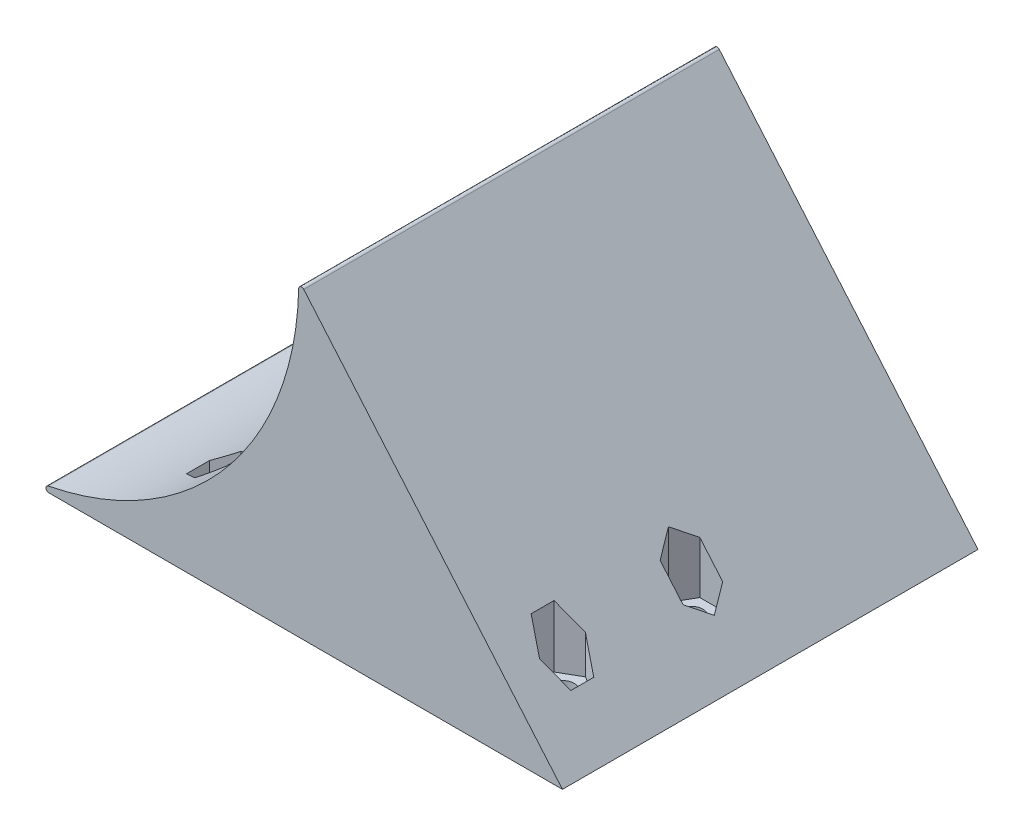
ISO-10303-21;
HEADER;
FILE_DESCRIPTION(('STEP AP214'),'2;1');
FILE_NAME('part.step','',(''),(''),'','','');
FILE_SCHEMA(('AUTOMOTIVE_DESIGN { 1 0 10303 214 1 1 1 1 }'));
ENDSEC;
DATA;
#1=APPLICATION_CONTEXT('core data for automotive mechanical design processes');
#2=APPLICATION_PROTOCOL_DEFINITION('international standard','automotive_design',2000,#1);
#3=PRODUCT_CONTEXT('',#1,'mechanical');
#4=PRODUCT('Part','Part','',(#3));
#5=PRODUCT_RELATED_PRODUCT_CATEGORY('part','',(#4));
#6=PRODUCT_DEFINITION_FORMATION('','',#4);
#7=PRODUCT_DEFINITION_CONTEXT('part definition',#1,'design');
#8=PRODUCT_DEFINITION('design','',#6,#7);
#9=PRODUCT_DEFINITION_SHAPE('','',#8);
#10=(LENGTH_UNIT() NAMED_UNIT(*) SI_UNIT(.MILLI.,.METRE.));
#11=(NAMED_UNIT(*) PLANE_ANGLE_UNIT() SI_UNIT($,.RADIAN.));
#12=(NAMED_UNIT(*) SI_UNIT($,.STERADIAN.) SOLID_ANGLE_UNIT());
#13=UNCERTAINTY_MEASURE_WITH_UNIT(LENGTH_MEASURE(1.E-05),#10,'distance_accuracy_value','');
#14=(GEOMETRIC_REPRESENTATION_CONTEXT(3) GLOBAL_UNCERTAINTY_ASSIGNED_CONTEXT((#13)) GLOBAL_UNIT_ASSIGNED_CONTEXT((#10,
#11,#12)) REPRESENTATION_CONTEXT('',''));
#15=CARTESIAN_POINT('',(0.,0.,0.));
#16=DIRECTION('',(0.,0.,1.));
#17=DIRECTION('',(1.,0.,0.));
#18=AXIS2_PLACEMENT_3D('',#15,#16,#17);
#19=CARTESIAN_POINT('',(0.,-54.,72.5));
#20=DIRECTION('',(0.,-1.,0.));
#21=DIRECTION('',(1.,0.,0.));
#22=AXIS2_PLACEMENT_3D('',#19,#20,#21);
#23=PLANE('',#22);
#24=DIRECTION('',(-1.,0.,0.));
#25=VECTOR('',#24,1.);
#26=CARTESIAN_POINT('',(0.,-54.,0.));
#27=LINE('',#26,#25);
#28=CARTESIAN_POINT('',(100.,-54.,0.));
#29=VERTEX_POINT('',#28);
#30=CARTESIAN_POINT('',(10.3923048454133,-54.,0.));
#31=VERTEX_POINT('',#30);
#32=EDGE_CURVE('E57',#29,#31,#27,.T.);
#33=ORIENTED_EDGE('',*,*,#32,.F.);
#34=DIRECTION('',(0.,0.,-1.));
#35=VECTOR('',#34,1.);
#36=CARTESIAN_POINT('',(100.,-54.,72.5));
#37=LINE('',#36,#35);
#38=CARTESIAN_POINT('',(100.,-54.,72.5));
#39=VERTEX_POINT('',#38);
#40=EDGE_CURVE('E216',#39,#29,#37,.T.);
#41=ORIENTED_EDGE('',*,*,#40,.F.);
#42=DIRECTION('',(-1.,0.,0.));
#43=VECTOR('',#42,1.);
#44=CARTESIAN_POINT('',(0.,-54.,72.5));
#45=LINE('',#44,#43);
#46=CARTESIAN_POINT('',(10.3923048454133,-54.,72.5));
#47=VERTEX_POINT('',#46);
#48=EDGE_CURVE('E441',#39,#47,#45,.T.);
#49=ORIENTED_EDGE('',*,*,#48,.T.);
#50=DIRECTION('',(0.,0.,-1.));
#51=VECTOR('',#50,1.);
#52=CARTESIAN_POINT('',(10.3923048454133,-54.,72.5));
#53=LINE('',#52,#51);
#54=EDGE_CURVE('E234',#47,#31,#53,.T.);
#55=ORIENTED_EDGE('',*,*,#54,.T.);
#56=EDGE_LOOP('',(#33,#41,#49,#55));
#57=FACE_BOUND('',#56,.T.);
#58=CARTESIAN_POINT('',(90.,-54.,62.5));
#59=DIRECTION('',(0.,-1.,0.));
#60=DIRECTION('',(1.,0.,0.));
#61=AXIS2_PLACEMENT_3D('',#58,#59,#60);
#62=CIRCLE('',#61,2.04999999999999);
#63=CARTESIAN_POINT('',(92.05,-54.,62.5));
#64=VERTEX_POINT('',#63);
#65=EDGE_CURVE('E475',#64,#64,#62,.T.);
#66=ORIENTED_EDGE('',*,*,#65,.F.);
#67=EDGE_LOOP('',(#66));
#68=FACE_BOUND('',#67,.T.);
#69=CARTESIAN_POINT('',(90.,-54.,40.0645605707371));
#70=DIRECTION('',(0.,1.,0.));
#71=DIRECTION('',(-1.,0.,0.));
#72=AXIS2_PLACEMENT_3D('',#69,#70,#71);
#73=CIRCLE('',#72,2.04999999999999);
#74=CARTESIAN_POINT('',(87.95,-54.,40.0645605707371));
#75=VERTEX_POINT('',#74);
#76=EDGE_CURVE('E466',#75,#75,#73,.T.);
#77=ORIENTED_EDGE('',*,*,#76,.T.);
#78=EDGE_LOOP('',(#77));
#79=FACE_BOUND('',#78,.T.);
#80=CARTESIAN_POINT('',(29.8923048454133,-54.,62.5));
#81=DIRECTION('',(0.,1.,0.));
#82=DIRECTION('',(-1.,0.,0.));
#83=AXIS2_PLACEMENT_3D('',#80,#81,#82);
#84=CIRCLE('',#83,2.04999999999999);
#85=CARTESIAN_POINT('',(27.8423048454133,-54.,62.5));
#86=VERTEX_POINT('',#85);
#87=EDGE_CURVE('E349',#86,#86,#84,.T.);
#88=ORIENTED_EDGE('',*,*,#87,.T.);
#89=EDGE_LOOP('',(#88));
#90=FACE_BOUND('',#89,.T.);
#91=ADVANCED_FACE('F42',(#57,#68,#79,#90),#23,.T.);
#92=CARTESIAN_POINT('',(0.,0.,72.5));
#93=DIRECTION('',(0.,0.,-1.));
#94=DIRECTION('',(-1.,0.,0.));
#95=AXIS2_PLACEMENT_3D('',#92,#93,#94);
#96=CYLINDRICAL_SURFACE('',#95,54.);
#97=CARTESIAN_POINT('',(0.,0.,0.));
#98=DIRECTION('',(0.,0.,1.));
#99=DIRECTION('',(1.,0.,0.));
#100=AXIS2_PLACEMENT_3D('',#97,#98,#99);
#101=CIRCLE('',#100,54.);
#102=CARTESIAN_POINT('',(10.2969625991251,-53.0091743119266,0.));
#103=VERTEX_POINT('',#102);
#104=CARTESIAN_POINT('',(53.9837068706725,-1.32642093669479,0.));
#105=VERTEX_POINT('',#104);
#106=EDGE_CURVE('E196',#103,#105,#101,.T.);
#107=ORIENTED_EDGE('',*,*,#106,.F.);
#108=DIRECTION('',(0.,0.,-1.));
#109=VECTOR('',#108,1.);
#110=CARTESIAN_POINT('',(10.2969625991251,-53.0091743119266,72.5));
#111=LINE('',#110,#109);
#112=CARTESIAN_POINT('',(10.2969625991251,-53.0091743119266,72.5));
#113=VERTEX_POINT('',#112);
#114=EDGE_CURVE('E207',#103,#113,#111,.F.);
#115=ORIENTED_EDGE('',*,*,#114,.T.);
#116=CARTESIAN_POINT('',(0.,0.,72.5));
#117=DIRECTION('',(0.,0.,1.));
#118=DIRECTION('',(1.,0.,0.));
#119=AXIS2_PLACEMENT_3D('',#116,#117,#118);
#120=CIRCLE('',#119,54.);
#121=CARTESIAN_POINT('',(53.9837068706725,-1.32642093669479,72.5));
#122=VERTEX_POINT('',#121);
#123=EDGE_CURVE('E438',#113,#122,#120,.T.);
#124=ORIENTED_EDGE('',*,*,#123,.T.);
#125=DIRECTION('',(0.,0.,-1.));
#126=VECTOR('',#125,1.);
#127=CARTESIAN_POINT('',(53.9837068706725,-1.32642093669479,72.5));
#128=LINE('',#127,#126);
#129=EDGE_CURVE('E210',#122,#105,#128,.T.);
#130=ORIENTED_EDGE('',*,*,#129,.T.);
#131=EDGE_LOOP('',(#107,#115,#124,#130));
#132=FACE_BOUND('',#131,.T.);
#133=CARTESIAN_POINT('',(0.,0.,75.7583302491976));
#134=DIRECTION('',(-0.499999999999998,0.,-0.86602540378444));
#135=DIRECTION('',(0.86602540378444,0.,-0.499999999999998));
#136=AXIS2_PLACEMENT_3D('',#133,#134,#135);
#137=ELLIPSE('',#136,62.3538290724795,54.);
#138=CARTESIAN_POINT('',(29.8923048454133,-44.9716589757247,58.5));
#139=VERTEX_POINT('',#138);
#140=CARTESIAN_POINT('',(26.4282032302755,-47.0908703892724,60.5));
#141=VERTEX_POINT('',#140);
#142=EDGE_CURVE('E51',#139,#141,#137,.T.);
#143=ORIENTED_EDGE('',*,*,#142,.F.);
#144=CARTESIAN_POINT('',(0.,0.,41.2416697508023));
#145=DIRECTION('',(0.5,0.,-0.866025403784439));
#146=DIRECTION('',(-0.866025403784439,0.,-0.5));
#147=AXIS2_PLACEMENT_3D('',#144,#145,#146);
#148=ELLIPSE('',#147,62.3538290724796,54.);
#149=CARTESIAN_POINT('',(33.356406460551,-42.4658703906856,60.5));
#150=VERTEX_POINT('',#149);
#151=EDGE_CURVE('E275',#150,#139,#148,.T.);
#152=ORIENTED_EDGE('',*,*,#151,.F.);
#153=DIRECTION('',(0.,0.,-1.));
#154=VECTOR('',#153,1.);
#155=CARTESIAN_POINT('',(33.356406460551,-42.4658703906856,72.5));
#156=LINE('',#155,#154);
#157=CARTESIAN_POINT('',(33.356406460551,-42.4658703906856,64.5));
#158=VERTEX_POINT('',#157);
#159=EDGE_CURVE('E278',#158,#150,#156,.T.);
#160=ORIENTED_EDGE('',*,*,#159,.F.);
#161=CARTESIAN_POINT('',(0.,0.,83.7583302491976));
#162=DIRECTION('',(0.499999999999997,0.,0.86602540378444));
#163=DIRECTION('',(0.866025403784441,0.,-0.499999999999997));
#164=AXIS2_PLACEMENT_3D('',#161,#162,#163);
#165=ELLIPSE('',#164,62.3538290724794,54.);
#166=CARTESIAN_POINT('',(29.8923048454133,-44.9716589757248,66.5));
#167=VERTEX_POINT('',#166);
#168=EDGE_CURVE('E281',#167,#158,#165,.T.);
#169=ORIENTED_EDGE('',*,*,#168,.F.);
#170=CARTESIAN_POINT('',(0.,0.,49.2416697508022));
#171=DIRECTION('',(-0.500000000000001,0.,0.866025403784438));
#172=DIRECTION('',(-0.866025403784438,0.,-0.500000000000001));
#173=AXIS2_PLACEMENT_3D('',#170,#171,#172);
#174=ELLIPSE('',#173,62.3538290724796,54.);
#175=CARTESIAN_POINT('',(26.4282032302755,-47.0908703892724,64.5));
#176=VERTEX_POINT('',#175);
#177=EDGE_CURVE('E284',#176,#167,#174,.T.);
#178=ORIENTED_EDGE('',*,*,#177,.F.);
#179=DIRECTION('',(0.,0.,-1.));
#180=VECTOR('',#179,1.);
#181=CARTESIAN_POINT('',(26.4282032302755,-47.0908703892724,72.5));
#182=LINE('',#181,#180);
#183=EDGE_CURVE('E287',#141,#176,#182,.F.);
#184=ORIENTED_EDGE('',*,*,#183,.F.);
#185=EDGE_LOOP('',(#143,#152,#160,#169,#178,#184));
#186=FACE_BOUND('',#185,.T.);
#187=ADVANCED_FACE('F204',(#132,#186),#96,.F.);
#188=CARTESIAN_POINT('',(31.2925278219396,26.6565977742448,72.5));
#189=DIRECTION('',(0.761243230486711,0.648466455599791,0.));
#190=DIRECTION('',(-0.648466455599791,0.761243230486711,0.));
#191=AXIS2_PLACEMENT_3D('',#188,#189,#190);
#192=PLANE('',#191);
#193=DIRECTION('',(0.648466455599791,-0.761243230486711,0.));
#194=VECTOR('',#193,1.);
#195=CARTESIAN_POINT('',(31.2925278219396,26.6565977742448,0.));
#196=LINE('',#195,#194);
#197=CARTESIAN_POINT('',(54.8641776236073,-1.01446938423466,0.));
#198=VERTEX_POINT('',#197);
#199=EDGE_CURVE('E462',#198,#29,#196,.T.);
#200=ORIENTED_EDGE('',*,*,#199,.F.);
#201=DIRECTION('',(0.,0.,-1.));
#202=VECTOR('',#201,1.);
#203=CARTESIAN_POINT('',(54.8641776236073,-1.01446938423466,72.5));
#204=LINE('',#203,#202);
#205=CARTESIAN_POINT('',(54.8641776236073,-1.01446938423466,72.5));
#206=VERTEX_POINT('',#205);
#207=EDGE_CURVE('E220',#198,#206,#204,.F.);
#208=ORIENTED_EDGE('',*,*,#207,.T.);
#209=DIRECTION('',(0.648466455599791,-0.761243230486711,0.));
#210=VECTOR('',#209,1.);
#211=CARTESIAN_POINT('',(31.2925278219396,26.6565977742448,72.5));
#212=LINE('',#211,#210);
#213=EDGE_CURVE('E223',#206,#39,#212,.T.);
#214=ORIENTED_EDGE('',*,*,#213,.T.);
#215=ORIENTED_EDGE('',*,*,#40,.T.);
#216=EDGE_LOOP('',(#200,#208,#214,#215));
#217=FACE_BOUND('',#216,.T.);
#218=DIRECTION('',(-0.648466455599791,0.761243230486711,0.));
#219=VECTOR('',#218,1.);
#220=CARTESIAN_POINT('',(31.2925278219396,26.6565977742448,36.5358983848622));
#221=LINE('',#220,#219);
#222=CARTESIAN_POINT('',(92.,-44.6086956521739,36.5358983848623));
#223=VERTEX_POINT('',#222);
#224=CARTESIAN_POINT('',(88.,-39.9130434782609,36.5358983848622));
#225=VERTEX_POINT('',#224);
#226=EDGE_CURVE('E272',#223,#225,#221,.T.);
#227=ORIENTED_EDGE('',*,*,#226,.F.);
#228=DIRECTION('',(-0.431207891910266,0.506200568764225,-0.746873977413245));
#229=VECTOR('',#228,1.);
#230=CARTESIAN_POINT('',(76.7389397220132,-26.6935379345372,10.102966606018));
#231=LINE('',#230,#229);
#232=CARTESIAN_POINT('',(94.0000000000001,-46.9565217391305,40.));
#233=VERTEX_POINT('',#232);
#234=EDGE_CURVE('E256',#233,#223,#231,.T.);
#235=ORIENTED_EDGE('',*,*,#234,.F.);
#236=DIRECTION('',(0.431207891910271,-0.506200568764231,-0.746873977413238));
#237=VECTOR('',#236,1.);
#238=CARTESIAN_POINT('',(55.8051727560175,-2.1191158440205,106.155381372892));
#239=LINE('',#238,#237);
#240=CARTESIAN_POINT('',(92.,-44.6086956521739,43.4641016151377));
#241=VERTEX_POINT('',#240);
#242=EDGE_CURVE('E259',#241,#233,#239,.T.);
#243=ORIENTED_EDGE('',*,*,#242,.F.);
#244=DIRECTION('',(0.648466455599791,-0.761243230486711,0.));
#245=VECTOR('',#244,1.);
#246=CARTESIAN_POINT('',(31.2925278219396,26.6565977742448,43.4641016151377));
#247=LINE('',#246,#245);
#248=CARTESIAN_POINT('',(88.0000000000001,-39.9130434782609,43.4641016151377));
#249=VERTEX_POINT('',#248);
#250=EDGE_CURVE('E263',#249,#241,#247,.T.);
#251=ORIENTED_EDGE('',*,*,#250,.F.);
#252=DIRECTION('',(0.431207891910265,-0.506200568764224,0.746873977413245));
#253=VECTOR('',#252,1.);
#254=CARTESIAN_POINT('',(72.2763738169166,-21.4548736111629,16.229982186817));
#255=LINE('',#254,#253);
#256=CARTESIAN_POINT('',(86.,-37.5652173913044,40.));
#257=VERTEX_POINT('',#256);
#258=EDGE_CURVE('E266',#257,#249,#255,.T.);
#259=ORIENTED_EDGE('',*,*,#258,.F.);
#260=DIRECTION('',(-0.431207891910264,0.506200568764223,0.746873977413247));
#261=VECTOR('',#260,1.);
#262=CARTESIAN_POINT('',(51.3426068509217,3.11954847935283,100.028365792093));
#263=LINE('',#262,#261);
#264=EDGE_CURVE('E269',#225,#257,#263,.T.);
#265=ORIENTED_EDGE('',*,*,#264,.F.);
#266=EDGE_LOOP('',(#227,#235,#243,#251,#259,#265));
#267=FACE_BOUND('',#266,.T.);
#268=DIRECTION('',(0.,0.,-1.));
#269=VECTOR('',#268,1.);
#270=CARTESIAN_POINT('',(93.4641016151378,-46.3274236351617,72.5));
#271=LINE('',#270,#269);
#272=CARTESIAN_POINT('',(93.4641016151378,-46.3274236351617,64.5));
#273=VERTEX_POINT('',#272);
#274=CARTESIAN_POINT('',(93.4641016151378,-46.3274236351617,60.5));
#275=VERTEX_POINT('',#274);
#276=EDGE_CURVE('E253',#273,#275,#271,.T.);
#277=ORIENTED_EDGE('',*,*,#276,.F.);
#278=DIRECTION('',(0.60729931370433,-0.712916585652909,-0.350624422245868));
#279=VECTOR('',#278,1.);
#280=CARTESIAN_POINT('',(37.2322730041311,19.683853429933,96.9654613855895));
#281=LINE('',#280,#279);
#282=CARTESIAN_POINT('',(90.,-42.2608695652174,66.5));
#283=VERTEX_POINT('',#282);
#284=EDGE_CURVE('E237',#283,#273,#281,.T.);
#285=ORIENTED_EDGE('',*,*,#284,.F.);
#286=DIRECTION('',(0.607299313704329,-0.712916585652908,0.350624422245871));
#287=VECTOR('',#286,1.);
#288=CARTESIAN_POINT('',(39.7874806561059,16.6842618384843,37.5097884401134));
#289=LINE('',#288,#287);
#290=CARTESIAN_POINT('',(86.5358983848622,-38.194315495273,64.5));
#291=VERTEX_POINT('',#290);
#292=EDGE_CURVE('E240',#291,#283,#289,.T.);
#293=ORIENTED_EDGE('',*,*,#292,.F.);
#294=DIRECTION('',(0.,0.,1.));
#295=VECTOR('',#294,1.);
#296=CARTESIAN_POINT('',(86.5358983848622,-38.194315495273,72.5000000000005));
#297=LINE('',#296,#295);
#298=CARTESIAN_POINT('',(86.5358983848623,-38.1943154952731,60.5));
#299=VERTEX_POINT('',#298);
#300=EDGE_CURVE('E244',#299,#291,#297,.T.);
#301=ORIENTED_EDGE('',*,*,#300,.F.);
#302=DIRECTION('',(-0.607299313704329,0.712916585652908,0.350624422245871));
#303=VECTOR('',#302,1.);
#304=CARTESIAN_POINT('',(35.528801236148,21.6835811575653,89.9489612693917));
#305=LINE('',#304,#303);
#306=CARTESIAN_POINT('',(90.,-42.2608695652174,58.5));
#307=VERTEX_POINT('',#306);
#308=EDGE_CURVE('E247',#307,#299,#305,.T.);
#309=ORIENTED_EDGE('',*,*,#308,.F.);
#310=DIRECTION('',(-0.607299313704329,0.712916585652908,-0.35062442224587));
#311=VECTOR('',#310,1.);
#312=CARTESIAN_POINT('',(41.490952424089,14.684534110852,30.4932883239154));
#313=LINE('',#312,#311);
#314=EDGE_CURVE('E250',#275,#307,#313,.T.);
#315=ORIENTED_EDGE('',*,*,#314,.F.);
#316=EDGE_LOOP('',(#277,#285,#293,#301,#309,#315));
#317=FACE_BOUND('',#316,.T.);
#318=ADVANCED_FACE('F449',(#217,#267,#317),#192,.T.);
#319=CARTESIAN_POINT('',(0.,0.,72.5));
#320=DIRECTION('',(0.,0.,1.));
#321=DIRECTION('',(1.,0.,0.));
#322=AXIS2_PLACEMENT_3D('',#319,#320,#321);
#323=PLANE('',#322);
#324=ORIENTED_EDGE('',*,*,#213,.F.);
#325=CARTESIAN_POINT('',(54.4835560083639,-1.33870261203456,72.5));
#326=DIRECTION('',(0.,0.,1.));
#327=DIRECTION('',(1.,0.,0.));
#328=AXIS2_PLACEMENT_3D('',#325,#326,#327);
#329=CIRCLE('',#328,0.5);
#330=EDGE_CURVE('E231',#206,#122,#329,.T.);
#331=ORIENTED_EDGE('',*,*,#330,.T.);
#332=ORIENTED_EDGE('',*,*,#123,.F.);
#333=CARTESIAN_POINT('',(10.3923048454133,-53.5,72.5));
#334=DIRECTION('',(0.,0.,1.));
#335=DIRECTION('',(1.,0.,0.));
#336=AXIS2_PLACEMENT_3D('',#333,#334,#335);
#337=CIRCLE('',#336,0.5);
#338=EDGE_CURVE('E214',#113,#47,#337,.T.);
#339=ORIENTED_EDGE('',*,*,#338,.T.);
#340=ORIENTED_EDGE('',*,*,#48,.F.);
#341=EDGE_LOOP('',(#324,#331,#332,#339,#340));
#342=FACE_BOUND('',#341,.T.);
#343=ADVANCED_FACE('F457',(#342),#323,.T.);
#344=CARTESIAN_POINT('',(54.4835560083639,-1.33870261203456,72.5));
#345=DIRECTION('',(0.,0.,-1.));
#346=DIRECTION('',(-1.,0.,0.));
#347=AXIS2_PLACEMENT_3D('',#344,#345,#346);
#348=CYLINDRICAL_SURFACE('',#347,0.5);
#349=CARTESIAN_POINT('',(54.4835560083639,-1.33870261203456,0.));
#350=DIRECTION('',(0.,0.,1.));
#351=DIRECTION('',(1.,0.,0.));
#352=AXIS2_PLACEMENT_3D('',#349,#350,#351);
#353=CIRCLE('',#352,0.5);
#354=EDGE_CURVE('E460',#105,#198,#353,.F.);
#355=ORIENTED_EDGE('',*,*,#354,.F.);
#356=ORIENTED_EDGE('',*,*,#129,.F.);
#357=ORIENTED_EDGE('',*,*,#330,.F.);
#358=ORIENTED_EDGE('',*,*,#207,.F.);
#359=EDGE_LOOP('',(#355,#356,#357,#358));
#360=FACE_BOUND('',#359,.T.);
#361=ADVANCED_FACE('F459',(#360),#348,.T.);
#362=CARTESIAN_POINT('',(10.3923048454133,-53.5,72.5));
#363=DIRECTION('',(0.,0.,-1.));
#364=DIRECTION('',(-1.,0.,0.));
#365=AXIS2_PLACEMENT_3D('',#362,#363,#364);
#366=CYLINDRICAL_SURFACE('',#365,0.5);
#367=CARTESIAN_POINT('',(10.3923048454133,-53.5,0.));
#368=DIRECTION('',(0.,0.,1.));
#369=DIRECTION('',(1.,0.,0.));
#370=AXIS2_PLACEMENT_3D('',#367,#368,#369);
#371=CIRCLE('',#370,0.5);
#372=EDGE_CURVE('E12',#31,#103,#371,.F.);
#373=ORIENTED_EDGE('',*,*,#372,.F.);
#374=ORIENTED_EDGE('',*,*,#54,.F.);
#375=ORIENTED_EDGE('',*,*,#338,.F.);
#376=ORIENTED_EDGE('',*,*,#114,.F.);
#377=EDGE_LOOP('',(#373,#374,#375,#376));
#378=FACE_BOUND('',#377,.T.);
#379=ADVANCED_FACE('F44',(#378),#366,.T.);
#380=CARTESIAN_POINT('',(0.,-49.,72.5));
#381=DIRECTION('',(0.,-1.,0.));
#382=DIRECTION('',(1.,0.,0.));
#383=AXIS2_PLACEMENT_3D('',#380,#381,#382);
#384=PLANE('',#383);
#385=CARTESIAN_POINT('',(90.,-49.,62.5));
#386=DIRECTION('',(0.,-1.,0.));
#387=DIRECTION('',(1.,0.,0.));
#388=AXIS2_PLACEMENT_3D('',#385,#386,#387);
#389=CIRCLE('',#388,2.04999999999999);
#390=CARTESIAN_POINT('',(92.05,-49.,62.5));
#391=VERTEX_POINT('',#390);
#392=EDGE_CURVE('E470',#391,#391,#389,.T.);
#393=ORIENTED_EDGE('',*,*,#392,.T.);
#394=EDGE_LOOP('',(#393));
#395=FACE_BOUND('',#394,.T.);
#396=DIRECTION('',(0.86602540378444,0.,-0.499999999999999));
#397=VECTOR('',#396,1.);
#398=CARTESIAN_POINT('',(90.,-49.,66.5));
#399=LINE('',#398,#397);
#400=CARTESIAN_POINT('',(90.,-49.,66.5));
#401=VERTEX_POINT('',#400);
#402=CARTESIAN_POINT('',(93.4641016151378,-49.,64.5));
#403=VERTEX_POINT('',#402);
#404=EDGE_CURVE('E396',#401,#403,#399,.T.);
#405=ORIENTED_EDGE('',*,*,#404,.T.);
#406=DIRECTION('',(0.,0.,-1.));
#407=VECTOR('',#406,1.);
#408=CARTESIAN_POINT('',(93.4641016151378,-49.,64.5));
#409=LINE('',#408,#407);
#410=CARTESIAN_POINT('',(93.4641016151378,-49.,60.5));
#411=VERTEX_POINT('',#410);
#412=EDGE_CURVE('E342',#403,#411,#409,.T.);
#413=ORIENTED_EDGE('',*,*,#412,.T.);
#414=DIRECTION('',(-0.866025403784439,0.,-0.5));
#415=VECTOR('',#414,1.);
#416=CARTESIAN_POINT('',(93.4641016151378,-49.,60.5));
#417=LINE('',#416,#415);
#418=CARTESIAN_POINT('',(90.,-49.,58.5));
#419=VERTEX_POINT('',#418);
#420=EDGE_CURVE('E417',#411,#419,#417,.T.);
#421=ORIENTED_EDGE('',*,*,#420,.T.);
#422=DIRECTION('',(-0.866025403784438,0.,0.500000000000002));
#423=VECTOR('',#422,1.);
#424=CARTESIAN_POINT('',(90.,-49.,58.5));
#425=LINE('',#424,#423);
#426=CARTESIAN_POINT('',(86.5358983848623,-49.,60.5));
#427=VERTEX_POINT('',#426);
#428=EDGE_CURVE('E412',#419,#427,#425,.T.);
#429=ORIENTED_EDGE('',*,*,#428,.T.);
#430=DIRECTION('',(0.,0.,1.));
#431=VECTOR('',#430,1.);
#432=CARTESIAN_POINT('',(86.5358983848623,-49.,60.5));
#433=LINE('',#432,#431);
#434=CARTESIAN_POINT('',(86.5358983848623,-49.,64.5));
#435=VERTEX_POINT('',#434);
#436=EDGE_CURVE('E407',#427,#435,#433,.T.);
#437=ORIENTED_EDGE('',*,*,#436,.T.);
#438=DIRECTION('',(0.866025403784438,0.,0.500000000000002));
#439=VECTOR('',#438,1.);
#440=CARTESIAN_POINT('',(86.5358983848623,-49.,64.5));
#441=LINE('',#440,#439);
#442=EDGE_CURVE('E402',#435,#401,#441,.T.);
#443=ORIENTED_EDGE('',*,*,#442,.T.);
#444=EDGE_LOOP('',(#405,#413,#421,#429,#437,#443));
#445=FACE_BOUND('',#444,.T.);
#446=ADVANCED_FACE('F536',(#395,#445),#384,.F.);
#447=CARTESIAN_POINT('',(93.4641016151378,-64.5830052442584,64.5));
#448=DIRECTION('',(1.,0.,0.));
#449=DIRECTION('',(0.,0.,-1.));
#450=AXIS2_PLACEMENT_3D('',#447,#448,#449);
#451=PLANE('',#450);
#452=ORIENTED_EDGE('',*,*,#276,.T.);
#453=DIRECTION('',(0.,1.,0.));
#454=VECTOR('',#453,1.);
#455=CARTESIAN_POINT('',(93.4641016151378,-64.5830052442584,60.5));
#456=LINE('',#455,#454);
#457=EDGE_CURVE('E395',#411,#275,#456,.T.);
#458=ORIENTED_EDGE('',*,*,#457,.F.);
#459=ORIENTED_EDGE('',*,*,#412,.F.);
#460=DIRECTION('',(0.,1.,0.));
#461=VECTOR('',#460,1.);
#462=CARTESIAN_POINT('',(93.4641016151378,-64.5830052442584,64.5));
#463=LINE('',#462,#461);
#464=EDGE_CURVE('E400',#403,#273,#463,.T.);
#465=ORIENTED_EDGE('',*,*,#464,.T.);
#466=EDGE_LOOP('',(#452,#458,#459,#465));
#467=FACE_BOUND('',#466,.T.);
#468=ADVANCED_FACE('F544',(#467),#451,.F.);
#469=CARTESIAN_POINT('',(93.4641016151378,-64.5830052442584,60.5));
#470=DIRECTION('',(0.5,0.,-0.866025403784439));
#471=DIRECTION('',(-0.866025403784439,0.,-0.5));
#472=AXIS2_PLACEMENT_3D('',#469,#470,#471);
#473=PLANE('',#472);
#474=ORIENTED_EDGE('',*,*,#314,.T.);
#475=DIRECTION('',(0.,1.,0.));
#476=VECTOR('',#475,1.);
#477=CARTESIAN_POINT('',(90.,-64.5830052442584,58.5));
#478=LINE('',#477,#476);
#479=EDGE_CURVE('E416',#419,#307,#478,.T.);
#480=ORIENTED_EDGE('',*,*,#479,.F.);
#481=ORIENTED_EDGE('',*,*,#420,.F.);
#482=ORIENTED_EDGE('',*,*,#457,.T.);
#483=EDGE_LOOP('',(#474,#480,#481,#482));
#484=FACE_BOUND('',#483,.T.);
#485=ADVANCED_FACE('F548',(#484),#473,.F.);
#486=CARTESIAN_POINT('',(90.,-64.5830052442584,58.5));
#487=DIRECTION('',(-0.500000000000001,0.,-0.866025403784438));
#488=DIRECTION('',(-0.866025403784438,0.,0.500000000000002));
#489=AXIS2_PLACEMENT_3D('',#486,#487,#488);
#490=PLANE('',#489);
#491=ORIENTED_EDGE('',*,*,#308,.T.);
#492=DIRECTION('',(0.,1.,0.));
#493=VECTOR('',#492,1.);
#494=CARTESIAN_POINT('',(86.5358983848623,-64.5830052442584,60.5));
#495=LINE('',#494,#493);
#496=EDGE_CURVE('E411',#427,#299,#495,.T.);
#497=ORIENTED_EDGE('',*,*,#496,.F.);
#498=ORIENTED_EDGE('',*,*,#428,.F.);
#499=ORIENTED_EDGE('',*,*,#479,.T.);
#500=EDGE_LOOP('',(#491,#497,#498,#499));
#501=FACE_BOUND('',#500,.T.);
#502=ADVANCED_FACE('F552',(#501),#490,.F.);
#503=CARTESIAN_POINT('',(86.5358983848623,-64.5830052442584,60.5));
#504=DIRECTION('',(-1.,0.,0.));
#505=DIRECTION('',(0.,0.,1.));
#506=AXIS2_PLACEMENT_3D('',#503,#504,#505);
#507=PLANE('',#506);
#508=ORIENTED_EDGE('',*,*,#300,.T.);
#509=DIRECTION('',(0.,1.,0.));
#510=VECTOR('',#509,1.);
#511=CARTESIAN_POINT('',(86.5358983848623,-64.5830052442584,64.5));
#512=LINE('',#511,#510);
#513=EDGE_CURVE('E406',#435,#291,#512,.T.);
#514=ORIENTED_EDGE('',*,*,#513,.F.);
#515=ORIENTED_EDGE('',*,*,#436,.F.);
#516=ORIENTED_EDGE('',*,*,#496,.T.);
#517=EDGE_LOOP('',(#508,#514,#515,#516));
#518=FACE_BOUND('',#517,.T.);
#519=ADVANCED_FACE('F556',(#518),#507,.F.);
#520=CARTESIAN_POINT('',(86.5358983848623,-64.5830052442584,64.5));
#521=DIRECTION('',(-0.500000000000001,0.,0.866025403784438));
#522=DIRECTION('',(0.866025403784438,0.,0.500000000000002));
#523=AXIS2_PLACEMENT_3D('',#520,#521,#522);
#524=PLANE('',#523);
#525=ORIENTED_EDGE('',*,*,#292,.T.);
#526=DIRECTION('',(0.,1.,0.));
#527=VECTOR('',#526,1.);
#528=CARTESIAN_POINT('',(90.,-64.5830052442584,66.5));
#529=LINE('',#528,#527);
#530=EDGE_CURVE('E401',#401,#283,#529,.T.);
#531=ORIENTED_EDGE('',*,*,#530,.F.);
#532=ORIENTED_EDGE('',*,*,#442,.F.);
#533=ORIENTED_EDGE('',*,*,#513,.T.);
#534=EDGE_LOOP('',(#525,#531,#532,#533));
#535=FACE_BOUND('',#534,.T.);
#536=ADVANCED_FACE('F560',(#535),#524,.F.);
#537=CARTESIAN_POINT('',(90.,-64.5830052442584,66.5));
#538=DIRECTION('',(0.499999999999998,0.,0.866025403784439));
#539=DIRECTION('',(0.86602540378444,0.,-0.499999999999999));
#540=AXIS2_PLACEMENT_3D('',#537,#538,#539);
#541=PLANE('',#540);
#542=ORIENTED_EDGE('',*,*,#284,.T.);
#543=ORIENTED_EDGE('',*,*,#464,.F.);
#544=ORIENTED_EDGE('',*,*,#404,.F.);
#545=ORIENTED_EDGE('',*,*,#530,.T.);
#546=EDGE_LOOP('',(#542,#543,#544,#545));
#547=FACE_BOUND('',#546,.T.);
#548=ADVANCED_FACE('F564',(#547),#541,.F.);
#549=CARTESIAN_POINT('',(0.,-49.,72.5));
#550=DIRECTION('',(0.,-1.,0.));
#551=DIRECTION('',(1.,0.,0.));
#552=AXIS2_PLACEMENT_3D('',#549,#550,#551);
#553=PLANE('',#552);
#554=CARTESIAN_POINT('',(90.,-49.,40.0645605707371));
#555=DIRECTION('',(0.,1.,0.));
#556=DIRECTION('',(-1.,0.,0.));
#557=AXIS2_PLACEMENT_3D('',#554,#555,#556);
#558=CIRCLE('',#557,2.04999999999999);
#559=CARTESIAN_POINT('',(87.95,-49.,40.0645605707371));
#560=VERTEX_POINT('',#559);
#561=EDGE_CURVE('E479',#560,#560,#558,.T.);
#562=ORIENTED_EDGE('',*,*,#561,.F.);
#563=EDGE_LOOP('',(#562));
#564=FACE_BOUND('',#563,.T.);
#565=DIRECTION('',(-0.500000000000002,0.,-0.866025403784438));
#566=VECTOR('',#565,1.);
#567=CARTESIAN_POINT('',(94.,-49.,40.));
#568=LINE('',#567,#566);
#569=CARTESIAN_POINT('',(94.,-49.,40.));
#570=VERTEX_POINT('',#569);
#571=CARTESIAN_POINT('',(92.,-49.,36.5358983848622));
#572=VERTEX_POINT('',#571);
#573=EDGE_CURVE('E350',#570,#572,#568,.T.);
#574=ORIENTED_EDGE('',*,*,#573,.T.);
#575=DIRECTION('',(-1.,0.,0.));
#576=VECTOR('',#575,1.);
#577=CARTESIAN_POINT('',(92.,-49.,36.5358983848622));
#578=LINE('',#577,#576);
#579=CARTESIAN_POINT('',(88.,-49.,36.5358983848622));
#580=VERTEX_POINT('',#579);
#581=EDGE_CURVE('E344',#572,#580,#578,.T.);
#582=ORIENTED_EDGE('',*,*,#581,.T.);
#583=DIRECTION('',(-0.5,0.,0.866025403784439));
#584=VECTOR('',#583,1.);
#585=CARTESIAN_POINT('',(88.,-49.,36.5358983848622));
#586=LINE('',#585,#584);
#587=CARTESIAN_POINT('',(86.,-49.,40.));
#588=VERTEX_POINT('',#587);
#589=EDGE_CURVE('E371',#580,#588,#586,.T.);
#590=ORIENTED_EDGE('',*,*,#589,.T.);
#591=DIRECTION('',(0.500000000000002,0.,0.866025403784438));
#592=VECTOR('',#591,1.);
#593=CARTESIAN_POINT('',(86.,-49.,40.));
#594=LINE('',#593,#592);
#595=CARTESIAN_POINT('',(88.,-49.,43.4641016151377));
#596=VERTEX_POINT('',#595);
#597=EDGE_CURVE('E366',#588,#596,#594,.T.);
#598=ORIENTED_EDGE('',*,*,#597,.T.);
#599=DIRECTION('',(1.,0.,0.));
#600=VECTOR('',#599,1.);
#601=CARTESIAN_POINT('',(88.,-49.,43.4641016151377));
#602=LINE('',#601,#600);
#603=CARTESIAN_POINT('',(92.,-49.,43.4641016151377));
#604=VERTEX_POINT('',#603);
#605=EDGE_CURVE('E361',#596,#604,#602,.T.);
#606=ORIENTED_EDGE('',*,*,#605,.T.);
#607=DIRECTION('',(0.50000000000001,0.,-0.866025403784433));
#608=VECTOR('',#607,1.);
#609=CARTESIAN_POINT('',(92.,-49.,43.4641016151377));
#610=LINE('',#609,#608);
#611=EDGE_CURVE('E356',#604,#570,#610,.T.);
#612=ORIENTED_EDGE('',*,*,#611,.T.);
#613=EDGE_LOOP('',(#574,#582,#590,#598,#606,#612));
#614=FACE_BOUND('',#613,.T.);
#615=ADVANCED_FACE('F568',(#564,#614),#553,.F.);
#616=CARTESIAN_POINT('',(92.,-64.5830052442584,36.5358983848622));
#617=DIRECTION('',(0.,0.,-1.));
#618=DIRECTION('',(-1.,0.,0.));
#619=AXIS2_PLACEMENT_3D('',#616,#617,#618);
#620=PLANE('',#619);
#621=ORIENTED_EDGE('',*,*,#226,.T.);
#622=DIRECTION('',(0.,1.,0.));
#623=VECTOR('',#622,1.);
#624=CARTESIAN_POINT('',(88.,-64.5830052442584,36.5358983848622));
#625=LINE('',#624,#623);
#626=EDGE_CURVE('E348',#580,#225,#625,.T.);
#627=ORIENTED_EDGE('',*,*,#626,.F.);
#628=ORIENTED_EDGE('',*,*,#581,.F.);
#629=DIRECTION('',(0.,1.,0.));
#630=VECTOR('',#629,1.);
#631=CARTESIAN_POINT('',(92.,-64.5830052442584,36.5358983848622));
#632=LINE('',#631,#630);
#633=EDGE_CURVE('E354',#572,#223,#632,.T.);
#634=ORIENTED_EDGE('',*,*,#633,.T.);
#635=EDGE_LOOP('',(#621,#627,#628,#634));
#636=FACE_BOUND('',#635,.T.);
#637=ADVANCED_FACE('F572',(#636),#620,.F.);
#638=CARTESIAN_POINT('',(88.,-64.5830052442584,36.5358983848622));
#639=DIRECTION('',(-0.866025403784439,0.,-0.5));
#640=DIRECTION('',(-0.5,0.,0.866025403784439));
#641=AXIS2_PLACEMENT_3D('',#638,#639,#640);
#642=PLANE('',#641);
#643=ORIENTED_EDGE('',*,*,#264,.T.);
#644=DIRECTION('',(0.,1.,0.));
#645=VECTOR('',#644,1.);
#646=CARTESIAN_POINT('',(86.,-64.5830052442584,40.));
#647=LINE('',#646,#645);
#648=EDGE_CURVE('E370',#588,#257,#647,.T.);
#649=ORIENTED_EDGE('',*,*,#648,.F.);
#650=ORIENTED_EDGE('',*,*,#589,.F.);
#651=ORIENTED_EDGE('',*,*,#626,.T.);
#652=EDGE_LOOP('',(#643,#649,#650,#651));
#653=FACE_BOUND('',#652,.T.);
#654=ADVANCED_FACE('F576',(#653),#642,.F.);
#655=CARTESIAN_POINT('',(86.,-64.5830052442584,40.));
#656=DIRECTION('',(-0.866025403784438,0.,0.500000000000001));
#657=DIRECTION('',(0.500000000000002,0.,0.866025403784438));
#658=AXIS2_PLACEMENT_3D('',#655,#656,#657);
#659=PLANE('',#658);
#660=ORIENTED_EDGE('',*,*,#258,.T.);
#661=DIRECTION('',(0.,1.,0.));
#662=VECTOR('',#661,1.);
#663=CARTESIAN_POINT('',(88.,-64.5830052442584,43.4641016151377));
#664=LINE('',#663,#662);
#665=EDGE_CURVE('E365',#596,#249,#664,.T.);
#666=ORIENTED_EDGE('',*,*,#665,.F.);
#667=ORIENTED_EDGE('',*,*,#597,.F.);
#668=ORIENTED_EDGE('',*,*,#648,.T.);
#669=EDGE_LOOP('',(#660,#666,#667,#668));
#670=FACE_BOUND('',#669,.T.);
#671=ADVANCED_FACE('F580',(#670),#659,.F.);
#672=CARTESIAN_POINT('',(88.,-64.5830052442584,43.4641016151377));
#673=DIRECTION('',(0.,0.,1.));
#674=DIRECTION('',(1.,0.,0.));
#675=AXIS2_PLACEMENT_3D('',#672,#673,#674);
#676=PLANE('',#675);
#677=ORIENTED_EDGE('',*,*,#250,.T.);
#678=DIRECTION('',(0.,1.,0.));
#679=VECTOR('',#678,1.);
#680=CARTESIAN_POINT('',(92.,-64.5830052442584,43.4641016151377));
#681=LINE('',#680,#679);
#682=EDGE_CURVE('E360',#604,#241,#681,.T.);
#683=ORIENTED_EDGE('',*,*,#682,.F.);
#684=ORIENTED_EDGE('',*,*,#605,.F.);
#685=ORIENTED_EDGE('',*,*,#665,.T.);
#686=EDGE_LOOP('',(#677,#683,#684,#685));
#687=FACE_BOUND('',#686,.T.);
#688=ADVANCED_FACE('F584',(#687),#676,.F.);
#689=CARTESIAN_POINT('',(92.,-64.5830052442584,43.4641016151377));
#690=DIRECTION('',(0.866025403784433,0.,0.50000000000001));
#691=DIRECTION('',(0.50000000000001,0.,-0.866025403784433));
#692=AXIS2_PLACEMENT_3D('',#689,#690,#691);
#693=PLANE('',#692);
#694=ORIENTED_EDGE('',*,*,#242,.T.);
#695=DIRECTION('',(0.,1.,0.));
#696=VECTOR('',#695,1.);
#697=CARTESIAN_POINT('',(94.,-64.5830052442584,40.));
#698=LINE('',#697,#696);
#699=EDGE_CURVE('E355',#570,#233,#698,.T.);
#700=ORIENTED_EDGE('',*,*,#699,.F.);
#701=ORIENTED_EDGE('',*,*,#611,.F.);
#702=ORIENTED_EDGE('',*,*,#682,.T.);
#703=EDGE_LOOP('',(#694,#700,#701,#702));
#704=FACE_BOUND('',#703,.T.);
#705=ADVANCED_FACE('F518',(#704),#693,.F.);
#706=CARTESIAN_POINT('',(94.,-64.5830052442584,40.));
#707=DIRECTION('',(0.866025403784437,0.,-0.500000000000002));
#708=DIRECTION('',(-0.500000000000002,0.,-0.866025403784438));
#709=AXIS2_PLACEMENT_3D('',#706,#707,#708);
#710=PLANE('',#709);
#711=ORIENTED_EDGE('',*,*,#234,.T.);
#712=ORIENTED_EDGE('',*,*,#633,.F.);
#713=ORIENTED_EDGE('',*,*,#573,.F.);
#714=ORIENTED_EDGE('',*,*,#699,.T.);
#715=EDGE_LOOP('',(#711,#712,#713,#714));
#716=FACE_BOUND('',#715,.T.);
#717=ADVANCED_FACE('F510',(#716),#710,.F.);
#718=CARTESIAN_POINT('',(0.,-49.,72.5));
#719=DIRECTION('',(0.,-1.,0.));
#720=DIRECTION('',(1.,0.,0.));
#721=AXIS2_PLACEMENT_3D('',#718,#719,#720);
#722=PLANE('',#721);
#723=CARTESIAN_POINT('',(29.8923048454133,-49.,62.5));
#724=DIRECTION('',(0.,1.,0.));
#725=DIRECTION('',(-1.,0.,0.));
#726=AXIS2_PLACEMENT_3D('',#723,#724,#725);
#727=CIRCLE('',#726,2.04999999999999);
#728=CARTESIAN_POINT('',(27.8423048454133,-49.,62.5));
#729=VERTEX_POINT('',#728);
#730=EDGE_CURVE('E474',#729,#729,#727,.T.);
#731=ORIENTED_EDGE('',*,*,#730,.F.);
#732=EDGE_LOOP('',(#731));
#733=FACE_BOUND('',#732,.T.);
#734=DIRECTION('',(-0.866025403784439,0.,-0.5));
#735=VECTOR('',#734,1.);
#736=CARTESIAN_POINT('',(33.356406460551,-49.,60.5));
#737=LINE('',#736,#735);
#738=CARTESIAN_POINT('',(33.356406460551,-49.,60.5));
#739=VERTEX_POINT('',#738);
#740=CARTESIAN_POINT('',(29.8923048454133,-49.,58.5));
#741=VERTEX_POINT('',#740);
#742=EDGE_CURVE('E343',#739,#741,#737,.T.);
#743=ORIENTED_EDGE('',*,*,#742,.T.);
#744=DIRECTION('',(-0.86602540378444,0.,0.499999999999998));
#745=VECTOR('',#744,1.);
#746=CARTESIAN_POINT('',(29.8923048454133,-49.,58.5));
#747=LINE('',#746,#745);
#748=CARTESIAN_POINT('',(26.4282032302755,-49.,60.5));
#749=VERTEX_POINT('',#748);
#750=EDGE_CURVE('E309',#741,#749,#747,.T.);
#751=ORIENTED_EDGE('',*,*,#750,.T.);
#752=DIRECTION('',(0.,0.,1.));
#753=VECTOR('',#752,1.);
#754=CARTESIAN_POINT('',(26.4282032302755,-49.,60.5));
#755=LINE('',#754,#753);
#756=CARTESIAN_POINT('',(26.4282032302755,-49.,64.5));
#757=VERTEX_POINT('',#756);
#758=EDGE_CURVE('E307',#749,#757,#755,.T.);
#759=ORIENTED_EDGE('',*,*,#758,.T.);
#760=DIRECTION('',(0.866025403784438,0.,0.500000000000001));
#761=VECTOR('',#760,1.);
#762=CARTESIAN_POINT('',(26.4282032302755,-49.,64.5));
#763=LINE('',#762,#761);
#764=CARTESIAN_POINT('',(29.8923048454133,-49.,66.5));
#765=VERTEX_POINT('',#764);
#766=EDGE_CURVE('E328',#757,#765,#763,.T.);
#767=ORIENTED_EDGE('',*,*,#766,.T.);
#768=DIRECTION('',(0.866025403784441,0.,-0.499999999999997));
#769=VECTOR('',#768,1.);
#770=CARTESIAN_POINT('',(29.8923048454133,-49.,66.5));
#771=LINE('',#770,#769);
#772=CARTESIAN_POINT('',(33.356406460551,-49.,64.5));
#773=VERTEX_POINT('',#772);
#774=EDGE_CURVE('E326',#765,#773,#771,.T.);
#775=ORIENTED_EDGE('',*,*,#774,.T.);
#776=DIRECTION('',(0.,0.,-1.));
#777=VECTOR('',#776,1.);
#778=CARTESIAN_POINT('',(33.356406460551,-49.,64.5));
#779=LINE('',#778,#777);
#780=EDGE_CURVE('E497',#773,#739,#779,.T.);
#781=ORIENTED_EDGE('',*,*,#780,.T.);
#782=EDGE_LOOP('',(#743,#751,#759,#767,#775,#781));
#783=FACE_BOUND('',#782,.T.);
#784=ADVANCED_FACE('F508',(#733,#783),#722,.F.);
#785=CARTESIAN_POINT('',(29.8923048454133,-64.5830052442584,58.5));
#786=DIRECTION('',(-0.499999999999998,0.,-0.86602540378444));
#787=DIRECTION('',(-0.86602540378444,0.,0.499999999999998));
#788=AXIS2_PLACEMENT_3D('',#785,#786,#787);
#789=PLANE('',#788);
#790=ORIENTED_EDGE('',*,*,#142,.T.);
#791=DIRECTION('',(0.,1.,0.));
#792=VECTOR('',#791,1.);
#793=CARTESIAN_POINT('',(26.4282032302755,-64.5830052442584,60.5));
#794=LINE('',#793,#792);
#795=EDGE_CURVE('E296',#749,#141,#794,.T.);
#796=ORIENTED_EDGE('',*,*,#795,.F.);
#797=ORIENTED_EDGE('',*,*,#750,.F.);
#798=DIRECTION('',(0.,1.,0.));
#799=VECTOR('',#798,1.);
#800=CARTESIAN_POINT('',(29.8923048454133,-64.5830052442584,58.5));
#801=LINE('',#800,#799);
#802=EDGE_CURVE('E299',#741,#139,#801,.T.);
#803=ORIENTED_EDGE('',*,*,#802,.T.);
#804=EDGE_LOOP('',(#790,#796,#797,#803));
#805=FACE_BOUND('',#804,.T.);
#806=ADVANCED_FACE('F295',(#805),#789,.F.);
#807=CARTESIAN_POINT('',(26.4282032302755,-64.5830052442584,60.5));
#808=DIRECTION('',(-1.,0.,0.));
#809=DIRECTION('',(0.,0.,1.));
#810=AXIS2_PLACEMENT_3D('',#807,#808,#809);
#811=PLANE('',#810);
#812=ORIENTED_EDGE('',*,*,#183,.T.);
#813=DIRECTION('',(0.,1.,0.));
#814=VECTOR('',#813,1.);
#815=CARTESIAN_POINT('',(26.4282032302755,-64.5830052442584,64.5));
#816=LINE('',#815,#814);
#817=EDGE_CURVE('E320',#757,#176,#816,.T.);
#818=ORIENTED_EDGE('',*,*,#817,.F.);
#819=ORIENTED_EDGE('',*,*,#758,.F.);
#820=ORIENTED_EDGE('',*,*,#795,.T.);
#821=EDGE_LOOP('',(#812,#818,#819,#820));
#822=FACE_BOUND('',#821,.T.);
#823=ADVANCED_FACE('F303',(#822),#811,.F.);
#824=CARTESIAN_POINT('',(26.4282032302755,-64.5830052442584,64.5));
#825=DIRECTION('',(-0.500000000000001,0.,0.866025403784438));
#826=DIRECTION('',(0.866025403784438,0.,0.500000000000001));
#827=AXIS2_PLACEMENT_3D('',#824,#825,#826);
#828=PLANE('',#827);
#829=ORIENTED_EDGE('',*,*,#177,.T.);
#830=DIRECTION('',(0.,1.,0.));
#831=VECTOR('',#830,1.);
#832=CARTESIAN_POINT('',(29.8923048454133,-64.5830052442584,66.5));
#833=LINE('',#832,#831);
#834=EDGE_CURVE('E318',#765,#167,#833,.T.);
#835=ORIENTED_EDGE('',*,*,#834,.F.);
#836=ORIENTED_EDGE('',*,*,#766,.F.);
#837=ORIENTED_EDGE('',*,*,#817,.T.);
#838=EDGE_LOOP('',(#829,#835,#836,#837));
#839=FACE_BOUND('',#838,.T.);
#840=ADVANCED_FACE('F317',(#839),#828,.F.);
#841=CARTESIAN_POINT('',(29.8923048454133,-64.5830052442584,66.5));
#842=DIRECTION('',(0.499999999999997,0.,0.86602540378444));
#843=DIRECTION('',(0.866025403784441,0.,-0.499999999999997));
#844=AXIS2_PLACEMENT_3D('',#841,#842,#843);
#845=PLANE('',#844);
#846=ORIENTED_EDGE('',*,*,#168,.T.);
#847=DIRECTION('',(0.,1.,0.));
#848=VECTOR('',#847,1.);
#849=CARTESIAN_POINT('',(33.356406460551,-64.5830052442584,64.5));
#850=LINE('',#849,#848);
#851=EDGE_CURVE('E332',#773,#158,#850,.T.);
#852=ORIENTED_EDGE('',*,*,#851,.F.);
#853=ORIENTED_EDGE('',*,*,#774,.F.);
#854=ORIENTED_EDGE('',*,*,#834,.T.);
#855=EDGE_LOOP('',(#846,#852,#853,#854));
#856=FACE_BOUND('',#855,.T.);
#857=ADVANCED_FACE('F322',(#856),#845,.F.);
#858=CARTESIAN_POINT('',(33.356406460551,-64.5830052442584,64.5));
#859=DIRECTION('',(1.,0.,0.));
#860=DIRECTION('',(0.,0.,-1.));
#861=AXIS2_PLACEMENT_3D('',#858,#859,#860);
#862=PLANE('',#861);
#863=ORIENTED_EDGE('',*,*,#159,.T.);
#864=DIRECTION('',(0.,1.,0.));
#865=VECTOR('',#864,1.);
#866=CARTESIAN_POINT('',(33.356406460551,-64.5830052442584,60.5));
#867=LINE('',#866,#865);
#868=EDGE_CURVE('E65',#739,#150,#867,.T.);
#869=ORIENTED_EDGE('',*,*,#868,.F.);
#870=ORIENTED_EDGE('',*,*,#780,.F.);
#871=ORIENTED_EDGE('',*,*,#851,.T.);
#872=EDGE_LOOP('',(#863,#869,#870,#871));
#873=FACE_BOUND('',#872,.T.);
#874=ADVANCED_FACE('F505',(#873),#862,.F.);
#875=CARTESIAN_POINT('',(33.356406460551,-64.5830052442584,60.5));
#876=DIRECTION('',(0.5,0.,-0.866025403784439));
#877=DIRECTION('',(-0.866025403784439,0.,-0.5));
#878=AXIS2_PLACEMENT_3D('',#875,#876,#877);
#879=PLANE('',#878);
#880=ORIENTED_EDGE('',*,*,#151,.T.);
#881=ORIENTED_EDGE('',*,*,#802,.F.);
#882=ORIENTED_EDGE('',*,*,#742,.F.);
#883=ORIENTED_EDGE('',*,*,#868,.T.);
#884=EDGE_LOOP('',(#880,#881,#882,#883));
#885=FACE_BOUND('',#884,.T.);
#886=ADVANCED_FACE('F506',(#885),#879,.F.);
#887=CARTESIAN_POINT('',(29.8923048454133,-54.,62.5));
#888=DIRECTION('',(0.,1.,0.));
#889=DIRECTION('',(-1.,0.,0.));
#890=AXIS2_PLACEMENT_3D('',#887,#888,#889);
#891=CYLINDRICAL_SURFACE('',#890,2.04999999999999);
#892=ORIENTED_EDGE('',*,*,#87,.F.);
#893=EDGE_LOOP('',(#892));
#894=FACE_BOUND('',#893,.T.);
#895=ORIENTED_EDGE('',*,*,#730,.T.);
#896=EDGE_LOOP('',(#895));
#897=FACE_BOUND('',#896,.T.);
#898=ADVANCED_FACE('F674',(#894,#897),#891,.F.);
#899=CARTESIAN_POINT('',(90.,-54.,40.0645605707371));
#900=DIRECTION('',(0.,1.,0.));
#901=DIRECTION('',(-1.,0.,0.));
#902=AXIS2_PLACEMENT_3D('',#899,#900,#901);
#903=CYLINDRICAL_SURFACE('',#902,2.04999999999999);
#904=ORIENTED_EDGE('',*,*,#76,.F.);
#905=EDGE_LOOP('',(#904));
#906=FACE_BOUND('',#905,.T.);
#907=ORIENTED_EDGE('',*,*,#561,.T.);
#908=EDGE_LOOP('',(#907));
#909=FACE_BOUND('',#908,.T.);
#910=ADVANCED_FACE('F704',(#906,#909),#903,.F.);
#911=CARTESIAN_POINT('',(90.,-54.,62.5));
#912=DIRECTION('',(0.,1.,0.));
#913=DIRECTION('',(-1.,0.,0.));
#914=AXIS2_PLACEMENT_3D('',#911,#912,#913);
#915=CYLINDRICAL_SURFACE('',#914,2.04999999999999);
#916=ORIENTED_EDGE('',*,*,#65,.T.);
#917=EDGE_LOOP('',(#916));
#918=FACE_BOUND('',#917,.T.);
#919=ORIENTED_EDGE('',*,*,#392,.F.);
#920=EDGE_LOOP('',(#919));
#921=FACE_BOUND('',#920,.T.);
#922=ADVANCED_FACE('F713',(#918,#921),#915,.F.);
#923=CARTESIAN_POINT('',(51.8987462648031,-54.,0.));
#924=DIRECTION('',(0.,0.,1.));
#925=DIRECTION('',(1.,0.,0.));
#926=AXIS2_PLACEMENT_3D('',#923,#924,#925);
#927=PLANE('',#926);
#928=ORIENTED_EDGE('',*,*,#199,.T.);
#929=ORIENTED_EDGE('',*,*,#32,.T.);
#930=ORIENTED_EDGE('',*,*,#372,.T.);
#931=ORIENTED_EDGE('',*,*,#106,.T.);
#932=ORIENTED_EDGE('',*,*,#354,.T.);
#933=EDGE_LOOP('',(#928,#929,#930,#931,#932));
#934=FACE_BOUND('',#933,.T.);
#935=ADVANCED_FACE('F195',(#934),#927,.F.);
#936=CLOSED_SHELL('',(#91,#187,#318,#343,#361,#379,#446,#468,#485,#502,#519,#536,#548,#615,#637,
#654,#671,#688,#705,#717,#784,#806,#823,#840,#857,#874,#886,#898,#910,#922,#935));
#937=MANIFOLD_SOLID_BREP('B2',#936);
#938=ADVANCED_BREP_SHAPE_REPRESENTATION('',(#18,#937),#14);
#939=SHAPE_DEFINITION_REPRESENTATION(#9,#938);
ENDSEC;
END-ISO-10303-21;
